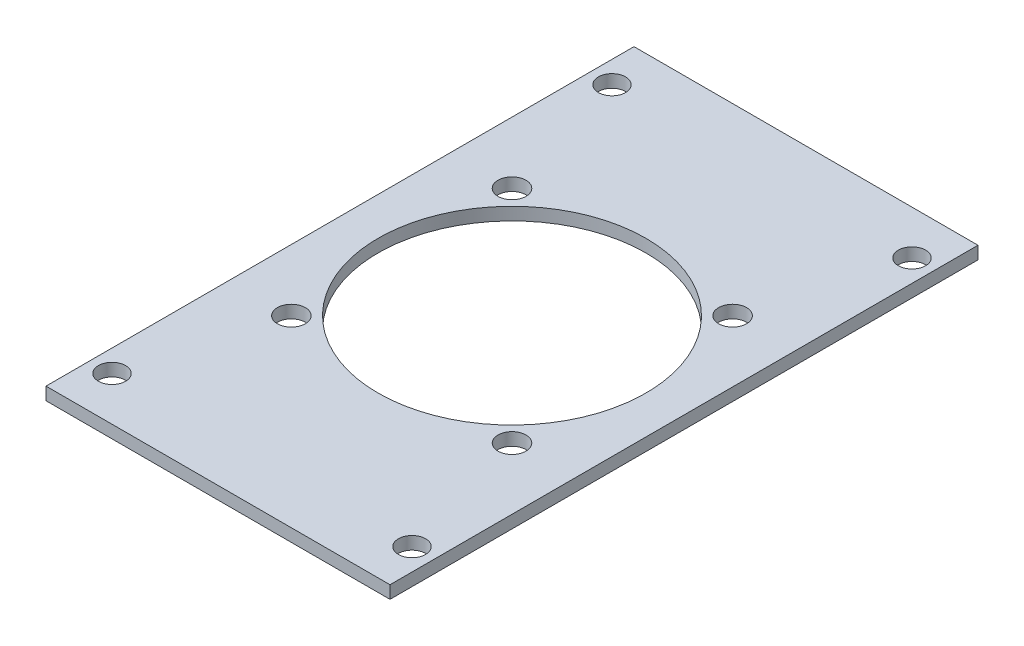
ISO-10303-21;
HEADER;
FILE_DESCRIPTION(('STEP AP214'),'2;1');
FILE_NAME('part.step','',(''),(''),'','','');
FILE_SCHEMA(('AUTOMOTIVE_DESIGN { 1 0 10303 214 1 1 1 1 }'));
ENDSEC;
DATA;
#1=APPLICATION_CONTEXT('core data for automotive mechanical design processes');
#2=APPLICATION_PROTOCOL_DEFINITION('international standard','automotive_design',2000,#1);
#3=PRODUCT_CONTEXT('',#1,'mechanical');
#4=PRODUCT('Part','Part','',(#3));
#5=PRODUCT_RELATED_PRODUCT_CATEGORY('part','',(#4));
#6=PRODUCT_DEFINITION_FORMATION('','',#4);
#7=PRODUCT_DEFINITION_CONTEXT('part definition',#1,'design');
#8=PRODUCT_DEFINITION('design','',#6,#7);
#9=PRODUCT_DEFINITION_SHAPE('','',#8);
#10=(LENGTH_UNIT() NAMED_UNIT(*) SI_UNIT(.MILLI.,.METRE.));
#11=(NAMED_UNIT(*) PLANE_ANGLE_UNIT() SI_UNIT($,.RADIAN.));
#12=(NAMED_UNIT(*) SI_UNIT($,.STERADIAN.) SOLID_ANGLE_UNIT());
#13=UNCERTAINTY_MEASURE_WITH_UNIT(LENGTH_MEASURE(1.E-05),#10,'distance_accuracy_value','');
#14=(GEOMETRIC_REPRESENTATION_CONTEXT(3) GLOBAL_UNCERTAINTY_ASSIGNED_CONTEXT((#13)) GLOBAL_UNIT_ASSIGNED_CONTEXT((#10,
#11,#12)) REPRESENTATION_CONTEXT('',''));
#15=CARTESIAN_POINT('',(0.,0.,0.));
#16=DIRECTION('',(0.,0.,1.));
#17=DIRECTION('',(1.,0.,0.));
#18=AXIS2_PLACEMENT_3D('',#15,#16,#17);
#19=CARTESIAN_POINT('',(0.,3.17499999999998,0.));
#20=DIRECTION('',(0.,-1.,0.));
#21=DIRECTION('',(0.,0.,-1.));
#22=AXIS2_PLACEMENT_3D('',#19,#20,#21);
#23=PLANE('',#22);
#24=CARTESIAN_POINT('',(-27.5771644662747,3.17499999999998,27.5771644662752));
#25=DIRECTION('',(0.,1.,0.));
#26=DIRECTION('',(0.,0.,1.));
#27=AXIS2_PLACEMENT_3D('',#24,#25,#26);
#28=CIRCLE('',#27,3.50000000000057);
#29=CARTESIAN_POINT('',(-27.5771644662747,3.17499999999998,31.0771644662758));
#30=VERTEX_POINT('',#29);
#31=EDGE_CURVE('E353',#30,#30,#28,.T.);
#32=ORIENTED_EDGE('',*,*,#31,.F.);
#33=EDGE_LOOP('',(#32));
#34=FACE_BOUND('',#33,.T.);
#35=CARTESIAN_POINT('',(27.577164466276,3.17499999999998,27.5771644662747));
#36=DIRECTION('',(0.,1.,0.));
#37=DIRECTION('',(0.,0.,1.));
#38=AXIS2_PLACEMENT_3D('',#35,#36,#37);
#39=CIRCLE('',#38,3.5000000000012);
#40=CARTESIAN_POINT('',(27.577164466276,3.17499999999998,31.0771644662759));
#41=VERTEX_POINT('',#40);
#42=EDGE_CURVE('E355',#41,#41,#39,.T.);
#43=ORIENTED_EDGE('',*,*,#42,.F.);
#44=EDGE_LOOP('',(#43));
#45=FACE_BOUND('',#44,.T.);
#46=CARTESIAN_POINT('',(27.5771644662757,3.17499999999998,-27.5771644662751));
#47=DIRECTION('',(0.,1.,0.));
#48=DIRECTION('',(0.,0.,1.));
#49=AXIS2_PLACEMENT_3D('',#46,#47,#48);
#50=CIRCLE('',#49,3.5);
#51=CARTESIAN_POINT('',(27.5771644662757,3.17499999999998,-24.0771644662751));
#52=VERTEX_POINT('',#51);
#53=EDGE_CURVE('E360',#52,#52,#50,.T.);
#54=ORIENTED_EDGE('',*,*,#53,.F.);
#55=EDGE_LOOP('',(#54));
#56=FACE_BOUND('',#55,.T.);
#57=CARTESIAN_POINT('',(-27.5771644662752,3.17499999999998,-27.5771644662755));
#58=DIRECTION('',(0.,1.,0.));
#59=DIRECTION('',(0.,0.,1.));
#60=AXIS2_PLACEMENT_3D('',#57,#58,#59);
#61=CIRCLE('',#60,3.5);
#62=CARTESIAN_POINT('',(-27.5771644662752,3.17499999999998,-24.0771644662755));
#63=VERTEX_POINT('',#62);
#64=EDGE_CURVE('E133',#63,#63,#61,.T.);
#65=ORIENTED_EDGE('',*,*,#64,.F.);
#66=EDGE_LOOP('',(#65));
#67=FACE_BOUND('',#66,.T.);
#68=DIRECTION('',(0.,0.,-1.));
#69=VECTOR('',#68,1.);
#70=CARTESIAN_POINT('',(43.,3.17500000000001,73.5));
#71=LINE('',#70,#69);
#72=CARTESIAN_POINT('',(43.,3.17500000000001,73.5));
#73=VERTEX_POINT('',#72);
#74=CARTESIAN_POINT('',(43.,3.17499999999998,-73.5));
#75=VERTEX_POINT('',#74);
#76=EDGE_CURVE('E95',#73,#75,#71,.T.);
#77=ORIENTED_EDGE('',*,*,#76,.T.);
#78=DIRECTION('',(-1.,0.,0.));
#79=VECTOR('',#78,1.);
#80=CARTESIAN_POINT('',(-43.,3.17499999999998,-73.5));
#81=LINE('',#80,#79);
#82=CARTESIAN_POINT('',(-43.,3.17499999999998,-73.5));
#83=VERTEX_POINT('',#82);
#84=EDGE_CURVE('E90',#75,#83,#81,.T.);
#85=ORIENTED_EDGE('',*,*,#84,.T.);
#86=DIRECTION('',(0.,0.,1.));
#87=VECTOR('',#86,1.);
#88=CARTESIAN_POINT('',(-43.,3.17500000000001,73.5));
#89=LINE('',#88,#87);
#90=CARTESIAN_POINT('',(-43.,3.17500000000001,73.5));
#91=VERTEX_POINT('',#90);
#92=EDGE_CURVE('E93',#83,#91,#89,.T.);
#93=ORIENTED_EDGE('',*,*,#92,.T.);
#94=DIRECTION('',(1.,0.,0.));
#95=VECTOR('',#94,1.);
#96=CARTESIAN_POINT('',(-43.,3.17500000000001,73.5));
#97=LINE('',#96,#95);
#98=EDGE_CURVE('E60',#91,#73,#97,.T.);
#99=ORIENTED_EDGE('',*,*,#98,.T.);
#100=EDGE_LOOP('',(#77,#85,#93,#99));
#101=FACE_BOUND('',#100,.T.);
#102=CARTESIAN_POINT('',(0.,3.17499999999998,0.));
#103=DIRECTION('',(0.,1.,0.));
#104=DIRECTION('',(0.,0.,1.));
#105=AXIS2_PLACEMENT_3D('',#102,#103,#104);
#106=CIRCLE('',#105,33.5);
#107=CARTESIAN_POINT('',(0.,3.17499999999998,33.5));
#108=VERTEX_POINT('',#107);
#109=EDGE_CURVE('E117',#108,#108,#106,.T.);
#110=ORIENTED_EDGE('',*,*,#109,.F.);
#111=EDGE_LOOP('',(#110));
#112=FACE_BOUND('',#111,.T.);
#113=CARTESIAN_POINT('',(-37.5,3.17500000000001,62.5));
#114=DIRECTION('',(0.,1.,0.));
#115=DIRECTION('',(0.,0.,1.));
#116=AXIS2_PLACEMENT_3D('',#113,#114,#115);
#117=CIRCLE('',#116,3.4);
#118=CARTESIAN_POINT('',(-37.5,3.17500000000001,65.9));
#119=VERTEX_POINT('',#118);
#120=EDGE_CURVE('E177',#119,#119,#117,.T.);
#121=ORIENTED_EDGE('',*,*,#120,.F.);
#122=EDGE_LOOP('',(#121));
#123=FACE_BOUND('',#122,.T.);
#124=CARTESIAN_POINT('',(37.5,3.17500000000001,62.5));
#125=DIRECTION('',(0.,1.,0.));
#126=DIRECTION('',(0.,0.,1.));
#127=AXIS2_PLACEMENT_3D('',#124,#125,#126);
#128=CIRCLE('',#127,3.4);
#129=CARTESIAN_POINT('',(37.5,3.17500000000001,65.9));
#130=VERTEX_POINT('',#129);
#131=EDGE_CURVE('E169',#130,#130,#128,.T.);
#132=ORIENTED_EDGE('',*,*,#131,.F.);
#133=EDGE_LOOP('',(#132));
#134=FACE_BOUND('',#133,.T.);
#135=CARTESIAN_POINT('',(-37.5,3.17500000000001,-62.5));
#136=DIRECTION('',(0.,1.,0.));
#137=DIRECTION('',(0.,0.,1.));
#138=AXIS2_PLACEMENT_3D('',#135,#136,#137);
#139=CIRCLE('',#138,3.4);
#140=CARTESIAN_POINT('',(-37.5,3.17500000000001,-59.1));
#141=VERTEX_POINT('',#140);
#142=EDGE_CURVE('E161',#141,#141,#139,.T.);
#143=ORIENTED_EDGE('',*,*,#142,.F.);
#144=EDGE_LOOP('',(#143));
#145=FACE_BOUND('',#144,.T.);
#146=CARTESIAN_POINT('',(37.5,3.17500000000001,-62.5));
#147=DIRECTION('',(0.,1.,0.));
#148=DIRECTION('',(0.,0.,1.));
#149=AXIS2_PLACEMENT_3D('',#146,#147,#148);
#150=CIRCLE('',#149,3.4);
#151=CARTESIAN_POINT('',(37.5,3.17500000000001,-59.1));
#152=VERTEX_POINT('',#151);
#153=EDGE_CURVE('E150',#152,#152,#150,.T.);
#154=ORIENTED_EDGE('',*,*,#153,.F.);
#155=EDGE_LOOP('',(#154));
#156=FACE_BOUND('',#155,.T.);
#157=ADVANCED_FACE('F40',(#34,#45,#56,#67,#101,#112,#123,#134,#145,#156),#23,.F.);
#158=CARTESIAN_POINT('',(0.,0.,0.));
#159=DIRECTION('',(0.,-1.,0.));
#160=DIRECTION('',(0.,0.,-1.));
#161=AXIS2_PLACEMENT_3D('',#158,#159,#160);
#162=PLANE('',#161);
#163=CARTESIAN_POINT('',(-27.5771644662747,0.,27.5771644662753));
#164=DIRECTION('',(0.,-1.,0.));
#165=DIRECTION('',(0.,0.,-1.));
#166=AXIS2_PLACEMENT_3D('',#163,#164,#165);
#167=CIRCLE('',#166,3.50000000000057);
#168=CARTESIAN_POINT('',(-27.5771644662747,0.,24.0771644662747));
#169=VERTEX_POINT('',#168);
#170=EDGE_CURVE('E44',#169,#169,#167,.T.);
#171=ORIENTED_EDGE('',*,*,#170,.F.);
#172=EDGE_LOOP('',(#171));
#173=FACE_BOUND('',#172,.T.);
#174=CARTESIAN_POINT('',(27.5771644662759,0.,27.5771644662747));
#175=DIRECTION('',(0.,-1.,0.));
#176=DIRECTION('',(0.,0.,-1.));
#177=AXIS2_PLACEMENT_3D('',#174,#175,#176);
#178=CIRCLE('',#177,3.5000000000012);
#179=CARTESIAN_POINT('',(27.5771644662759,0.,24.0771644662735));
#180=VERTEX_POINT('',#179);
#181=EDGE_CURVE('E136',#180,#180,#178,.T.);
#182=ORIENTED_EDGE('',*,*,#181,.F.);
#183=EDGE_LOOP('',(#182));
#184=FACE_BOUND('',#183,.T.);
#185=CARTESIAN_POINT('',(27.5771644662756,0.,-27.5771644662751));
#186=DIRECTION('',(0.,-1.,0.));
#187=DIRECTION('',(0.,0.,-1.));
#188=AXIS2_PLACEMENT_3D('',#185,#186,#187);
#189=CIRCLE('',#188,3.5);
#190=CARTESIAN_POINT('',(27.5771644662756,0.,-31.0771644662751));
#191=VERTEX_POINT('',#190);
#192=EDGE_CURVE('E132',#191,#191,#189,.T.);
#193=ORIENTED_EDGE('',*,*,#192,.F.);
#194=EDGE_LOOP('',(#193));
#195=FACE_BOUND('',#194,.T.);
#196=CARTESIAN_POINT('',(-27.5771644662752,0.,-27.5771644662755));
#197=DIRECTION('',(0.,-1.,0.));
#198=DIRECTION('',(0.,0.,-1.));
#199=AXIS2_PLACEMENT_3D('',#196,#197,#198);
#200=CIRCLE('',#199,3.5);
#201=CARTESIAN_POINT('',(-27.5771644662752,0.,-31.0771644662755));
#202=VERTEX_POINT('',#201);
#203=EDGE_CURVE('E128',#202,#202,#200,.T.);
#204=ORIENTED_EDGE('',*,*,#203,.F.);
#205=EDGE_LOOP('',(#204));
#206=FACE_BOUND('',#205,.T.);
#207=CARTESIAN_POINT('',(-37.5,0.,-62.5));
#208=DIRECTION('',(0.,1.,0.));
#209=DIRECTION('',(0.,0.,1.));
#210=AXIS2_PLACEMENT_3D('',#207,#208,#209);
#211=CIRCLE('',#210,3.4);
#212=CARTESIAN_POINT('',(-37.5,0.,-59.1));
#213=VERTEX_POINT('',#212);
#214=EDGE_CURVE('E157',#213,#213,#211,.T.);
#215=ORIENTED_EDGE('',*,*,#214,.T.);
#216=EDGE_LOOP('',(#215));
#217=FACE_BOUND('',#216,.T.);
#218=CARTESIAN_POINT('',(-37.5,0.,62.5));
#219=DIRECTION('',(0.,1.,0.));
#220=DIRECTION('',(0.,0.,1.));
#221=AXIS2_PLACEMENT_3D('',#218,#219,#220);
#222=CIRCLE('',#221,3.4);
#223=CARTESIAN_POINT('',(-37.5,0.,65.9));
#224=VERTEX_POINT('',#223);
#225=EDGE_CURVE('E173',#224,#224,#222,.T.);
#226=ORIENTED_EDGE('',*,*,#225,.T.);
#227=EDGE_LOOP('',(#226));
#228=FACE_BOUND('',#227,.T.);
#229=DIRECTION('',(0.,0.,-1.));
#230=VECTOR('',#229,1.);
#231=CARTESIAN_POINT('',(43.,0.,73.5));
#232=LINE('',#231,#230);
#233=CARTESIAN_POINT('',(43.,0.,73.5));
#234=VERTEX_POINT('',#233);
#235=CARTESIAN_POINT('',(43.,0.,-73.5000000000001));
#236=VERTEX_POINT('',#235);
#237=EDGE_CURVE('E113',#234,#236,#232,.T.);
#238=ORIENTED_EDGE('',*,*,#237,.F.);
#239=DIRECTION('',(1.,0.,0.));
#240=VECTOR('',#239,1.);
#241=CARTESIAN_POINT('',(-43.,0.,73.5));
#242=LINE('',#241,#240);
#243=CARTESIAN_POINT('',(-43.,0.,73.5));
#244=VERTEX_POINT('',#243);
#245=EDGE_CURVE('E83',#244,#234,#242,.T.);
#246=ORIENTED_EDGE('',*,*,#245,.F.);
#247=DIRECTION('',(0.,0.,1.));
#248=VECTOR('',#247,1.);
#249=CARTESIAN_POINT('',(-43.,0.,73.5));
#250=LINE('',#249,#248);
#251=CARTESIAN_POINT('',(-43.,0.,-73.5));
#252=VERTEX_POINT('',#251);
#253=EDGE_CURVE('E77',#252,#244,#250,.T.);
#254=ORIENTED_EDGE('',*,*,#253,.F.);
#255=DIRECTION('',(-1.,0.,0.));
#256=VECTOR('',#255,1.);
#257=CARTESIAN_POINT('',(-43.,0.,-73.5));
#258=LINE('',#257,#256);
#259=EDGE_CURVE('E100',#236,#252,#258,.T.);
#260=ORIENTED_EDGE('',*,*,#259,.F.);
#261=EDGE_LOOP('',(#238,#246,#254,#260));
#262=FACE_BOUND('',#261,.T.);
#263=CARTESIAN_POINT('',(0.,0.,0.));
#264=DIRECTION('',(0.,1.,0.));
#265=DIRECTION('',(0.,0.,1.));
#266=AXIS2_PLACEMENT_3D('',#263,#264,#265);
#267=CIRCLE('',#266,33.5);
#268=CARTESIAN_POINT('',(0.,0.,33.5));
#269=VERTEX_POINT('',#268);
#270=EDGE_CURVE('E181',#269,#269,#267,.T.);
#271=ORIENTED_EDGE('',*,*,#270,.T.);
#272=EDGE_LOOP('',(#271));
#273=FACE_BOUND('',#272,.T.);
#274=CARTESIAN_POINT('',(37.5,0.,62.5));
#275=DIRECTION('',(0.,1.,0.));
#276=DIRECTION('',(0.,0.,1.));
#277=AXIS2_PLACEMENT_3D('',#274,#275,#276);
#278=CIRCLE('',#277,3.4);
#279=CARTESIAN_POINT('',(37.5,0.,65.9));
#280=VERTEX_POINT('',#279);
#281=EDGE_CURVE('E165',#280,#280,#278,.T.);
#282=ORIENTED_EDGE('',*,*,#281,.T.);
#283=EDGE_LOOP('',(#282));
#284=FACE_BOUND('',#283,.T.);
#285=CARTESIAN_POINT('',(37.5,0.,-62.5));
#286=DIRECTION('',(0.,1.,0.));
#287=DIRECTION('',(0.,0.,1.));
#288=AXIS2_PLACEMENT_3D('',#285,#286,#287);
#289=CIRCLE('',#288,3.4);
#290=CARTESIAN_POINT('',(37.5,0.,-59.1));
#291=VERTEX_POINT('',#290);
#292=EDGE_CURVE('E144',#291,#291,#289,.T.);
#293=ORIENTED_EDGE('',*,*,#292,.T.);
#294=EDGE_LOOP('',(#293));
#295=FACE_BOUND('',#294,.T.);
#296=ADVANCED_FACE('F208',(#173,#184,#195,#206,#217,#228,#262,#273,#284,#295),#162,.T.);
#297=CARTESIAN_POINT('',(43.,3.17500000000001,73.5));
#298=DIRECTION('',(-1.,0.,0.));
#299=DIRECTION('',(0.,0.,1.));
#300=AXIS2_PLACEMENT_3D('',#297,#298,#299);
#301=PLANE('',#300);
#302=ORIENTED_EDGE('',*,*,#237,.T.);
#303=DIRECTION('',(0.,-1.,0.));
#304=VECTOR('',#303,1.);
#305=CARTESIAN_POINT('',(43.,3.17499999999998,-73.5));
#306=LINE('',#305,#304);
#307=EDGE_CURVE('E11',#75,#236,#306,.T.);
#308=ORIENTED_EDGE('',*,*,#307,.F.);
#309=ORIENTED_EDGE('',*,*,#76,.F.);
#310=DIRECTION('',(0.,-1.,0.));
#311=VECTOR('',#310,1.);
#312=CARTESIAN_POINT('',(43.,3.17500000000001,73.5));
#313=LINE('',#312,#311);
#314=EDGE_CURVE('E109',#73,#234,#313,.T.);
#315=ORIENTED_EDGE('',*,*,#314,.T.);
#316=EDGE_LOOP('',(#302,#308,#309,#315));
#317=FACE_BOUND('',#316,.T.);
#318=ADVANCED_FACE('F42',(#317),#301,.F.);
#319=CARTESIAN_POINT('',(-43.,3.17499999999998,-73.5));
#320=DIRECTION('',(0.,0.,1.));
#321=DIRECTION('',(1.,0.,0.));
#322=AXIS2_PLACEMENT_3D('',#319,#320,#321);
#323=PLANE('',#322);
#324=ORIENTED_EDGE('',*,*,#259,.T.);
#325=DIRECTION('',(0.,-1.,0.));
#326=VECTOR('',#325,1.);
#327=CARTESIAN_POINT('',(-43.,3.17499999999998,-73.5));
#328=LINE('',#327,#326);
#329=EDGE_CURVE('E51',#83,#252,#328,.T.);
#330=ORIENTED_EDGE('',*,*,#329,.F.);
#331=ORIENTED_EDGE('',*,*,#84,.F.);
#332=ORIENTED_EDGE('',*,*,#307,.T.);
#333=EDGE_LOOP('',(#324,#330,#331,#332));
#334=FACE_BOUND('',#333,.T.);
#335=ADVANCED_FACE('F99',(#334),#323,.F.);
#336=CARTESIAN_POINT('',(-43.,3.17500000000001,73.5));
#337=DIRECTION('',(1.,0.,0.));
#338=DIRECTION('',(0.,0.,-1.));
#339=AXIS2_PLACEMENT_3D('',#336,#337,#338);
#340=PLANE('',#339);
#341=ORIENTED_EDGE('',*,*,#253,.T.);
#342=DIRECTION('',(0.,-1.,0.));
#343=VECTOR('',#342,1.);
#344=CARTESIAN_POINT('',(-43.,3.17500000000001,73.5));
#345=LINE('',#344,#343);
#346=EDGE_CURVE('E102',#91,#244,#345,.T.);
#347=ORIENTED_EDGE('',*,*,#346,.F.);
#348=ORIENTED_EDGE('',*,*,#92,.F.);
#349=ORIENTED_EDGE('',*,*,#329,.T.);
#350=EDGE_LOOP('',(#341,#347,#348,#349));
#351=FACE_BOUND('',#350,.T.);
#352=ADVANCED_FACE('F104',(#351),#340,.F.);
#353=CARTESIAN_POINT('',(-43.,3.17500000000001,73.5));
#354=DIRECTION('',(0.,0.,-1.));
#355=DIRECTION('',(-1.,0.,0.));
#356=AXIS2_PLACEMENT_3D('',#353,#354,#355);
#357=PLANE('',#356);
#358=ORIENTED_EDGE('',*,*,#245,.T.);
#359=ORIENTED_EDGE('',*,*,#314,.F.);
#360=ORIENTED_EDGE('',*,*,#98,.F.);
#361=ORIENTED_EDGE('',*,*,#346,.T.);
#362=EDGE_LOOP('',(#358,#359,#360,#361));
#363=FACE_BOUND('',#362,.T.);
#364=ADVANCED_FACE('F214',(#363),#357,.F.);
#365=CARTESIAN_POINT('',(0.,3.17499999999998,0.));
#366=DIRECTION('',(0.,-1.,0.));
#367=DIRECTION('',(0.,0.,-1.));
#368=AXIS2_PLACEMENT_3D('',#365,#366,#367);
#369=CYLINDRICAL_SURFACE('',#368,33.5);
#370=ORIENTED_EDGE('',*,*,#109,.T.);
#371=EDGE_LOOP('',(#370));
#372=FACE_BOUND('',#371,.T.);
#373=ORIENTED_EDGE('',*,*,#270,.F.);
#374=EDGE_LOOP('',(#373));
#375=FACE_BOUND('',#374,.T.);
#376=ADVANCED_FACE('F211',(#372,#375),#369,.F.);
#377=CARTESIAN_POINT('',(-37.5,3.17500000000001,62.5));
#378=DIRECTION('',(0.,-1.,0.));
#379=DIRECTION('',(0.,0.,-1.));
#380=AXIS2_PLACEMENT_3D('',#377,#378,#379);
#381=CYLINDRICAL_SURFACE('',#380,3.4);
#382=ORIENTED_EDGE('',*,*,#120,.T.);
#383=EDGE_LOOP('',(#382));
#384=FACE_BOUND('',#383,.T.);
#385=ORIENTED_EDGE('',*,*,#225,.F.);
#386=EDGE_LOOP('',(#385));
#387=FACE_BOUND('',#386,.T.);
#388=ADVANCED_FACE('F213',(#384,#387),#381,.F.);
#389=CARTESIAN_POINT('',(37.5,3.17500000000001,62.5));
#390=DIRECTION('',(0.,-1.,0.));
#391=DIRECTION('',(0.,0.,-1.));
#392=AXIS2_PLACEMENT_3D('',#389,#390,#391);
#393=CYLINDRICAL_SURFACE('',#392,3.4);
#394=ORIENTED_EDGE('',*,*,#131,.T.);
#395=EDGE_LOOP('',(#394));
#396=FACE_BOUND('',#395,.T.);
#397=ORIENTED_EDGE('',*,*,#281,.F.);
#398=EDGE_LOOP('',(#397));
#399=FACE_BOUND('',#398,.T.);
#400=ADVANCED_FACE('F221',(#396,#399),#393,.F.);
#401=CARTESIAN_POINT('',(-37.5,3.17500000000001,-62.5));
#402=DIRECTION('',(0.,-1.,0.));
#403=DIRECTION('',(0.,0.,-1.));
#404=AXIS2_PLACEMENT_3D('',#401,#402,#403);
#405=CYLINDRICAL_SURFACE('',#404,3.4);
#406=ORIENTED_EDGE('',*,*,#142,.T.);
#407=EDGE_LOOP('',(#406));
#408=FACE_BOUND('',#407,.T.);
#409=ORIENTED_EDGE('',*,*,#214,.F.);
#410=EDGE_LOOP('',(#409));
#411=FACE_BOUND('',#410,.T.);
#412=ADVANCED_FACE('F288',(#408,#411),#405,.F.);
#413=CARTESIAN_POINT('',(37.5,3.17500000000001,-62.5));
#414=DIRECTION('',(0.,-1.,0.));
#415=DIRECTION('',(0.,0.,-1.));
#416=AXIS2_PLACEMENT_3D('',#413,#414,#415);
#417=CYLINDRICAL_SURFACE('',#416,3.4);
#418=ORIENTED_EDGE('',*,*,#153,.T.);
#419=EDGE_LOOP('',(#418));
#420=FACE_BOUND('',#419,.T.);
#421=ORIENTED_EDGE('',*,*,#292,.F.);
#422=EDGE_LOOP('',(#421));
#423=FACE_BOUND('',#422,.T.);
#424=ADVANCED_FACE('F297',(#420,#423),#417,.F.);
#425=CARTESIAN_POINT('',(-27.5771644662752,-6.825,-27.5771644662755));
#426=DIRECTION('',(0.,1.,0.));
#427=DIRECTION('',(0.,0.,1.));
#428=AXIS2_PLACEMENT_3D('',#425,#426,#427);
#429=CYLINDRICAL_SURFACE('',#428,3.5);
#430=ORIENTED_EDGE('',*,*,#203,.T.);
#431=EDGE_LOOP('',(#430));
#432=FACE_BOUND('',#431,.T.);
#433=ORIENTED_EDGE('',*,*,#64,.T.);
#434=EDGE_LOOP('',(#433));
#435=FACE_BOUND('',#434,.T.);
#436=ADVANCED_FACE('F306',(#432,#435),#429,.F.);
#437=CARTESIAN_POINT('',(27.5771644662756,-6.82499999999997,-27.5771644662751));
#438=DIRECTION('',(0.,1.,0.));
#439=DIRECTION('',(0.,0.,1.));
#440=AXIS2_PLACEMENT_3D('',#437,#438,#439);
#441=CYLINDRICAL_SURFACE('',#440,3.5);
#442=ORIENTED_EDGE('',*,*,#192,.T.);
#443=EDGE_LOOP('',(#442));
#444=FACE_BOUND('',#443,.T.);
#445=ORIENTED_EDGE('',*,*,#53,.T.);
#446=EDGE_LOOP('',(#445));
#447=FACE_BOUND('',#446,.T.);
#448=ADVANCED_FACE('F315',(#444,#447),#441,.F.);
#449=CARTESIAN_POINT('',(27.577164466276,-6.82499999999997,27.5771644662747));
#450=DIRECTION('',(0.,1.,0.));
#451=DIRECTION('',(0.,0.,1.));
#452=AXIS2_PLACEMENT_3D('',#449,#450,#451);
#453=CYLINDRICAL_SURFACE('',#452,3.5000000000012);
#454=ORIENTED_EDGE('',*,*,#181,.T.);
#455=EDGE_LOOP('',(#454));
#456=FACE_BOUND('',#455,.T.);
#457=ORIENTED_EDGE('',*,*,#42,.T.);
#458=EDGE_LOOP('',(#457));
#459=FACE_BOUND('',#458,.T.);
#460=ADVANCED_FACE('F324',(#456,#459),#453,.F.);
#461=CARTESIAN_POINT('',(-27.5771644662747,-6.82500000000005,27.5771644662753));
#462=DIRECTION('',(0.,1.,0.));
#463=DIRECTION('',(0.,0.,1.));
#464=AXIS2_PLACEMENT_3D('',#461,#462,#463);
#465=CYLINDRICAL_SURFACE('',#464,3.50000000000057);
#466=ORIENTED_EDGE('',*,*,#170,.T.);
#467=EDGE_LOOP('',(#466));
#468=FACE_BOUND('',#467,.T.);
#469=ORIENTED_EDGE('',*,*,#31,.T.);
#470=EDGE_LOOP('',(#469));
#471=FACE_BOUND('',#470,.T.);
#472=ADVANCED_FACE('F333',(#468,#471),#465,.F.);
#473=CLOSED_SHELL('',(#157,#296,#318,#335,#352,#364,#376,#388,#400,#412,#424,#436,#448,#460,#472));
#474=MANIFOLD_SOLID_BREP('B2',#473);
#475=ADVANCED_BREP_SHAPE_REPRESENTATION('',(#18,#474),#14);
#476=SHAPE_DEFINITION_REPRESENTATION(#9,#475);
ENDSEC;
END-ISO-10303-21;
